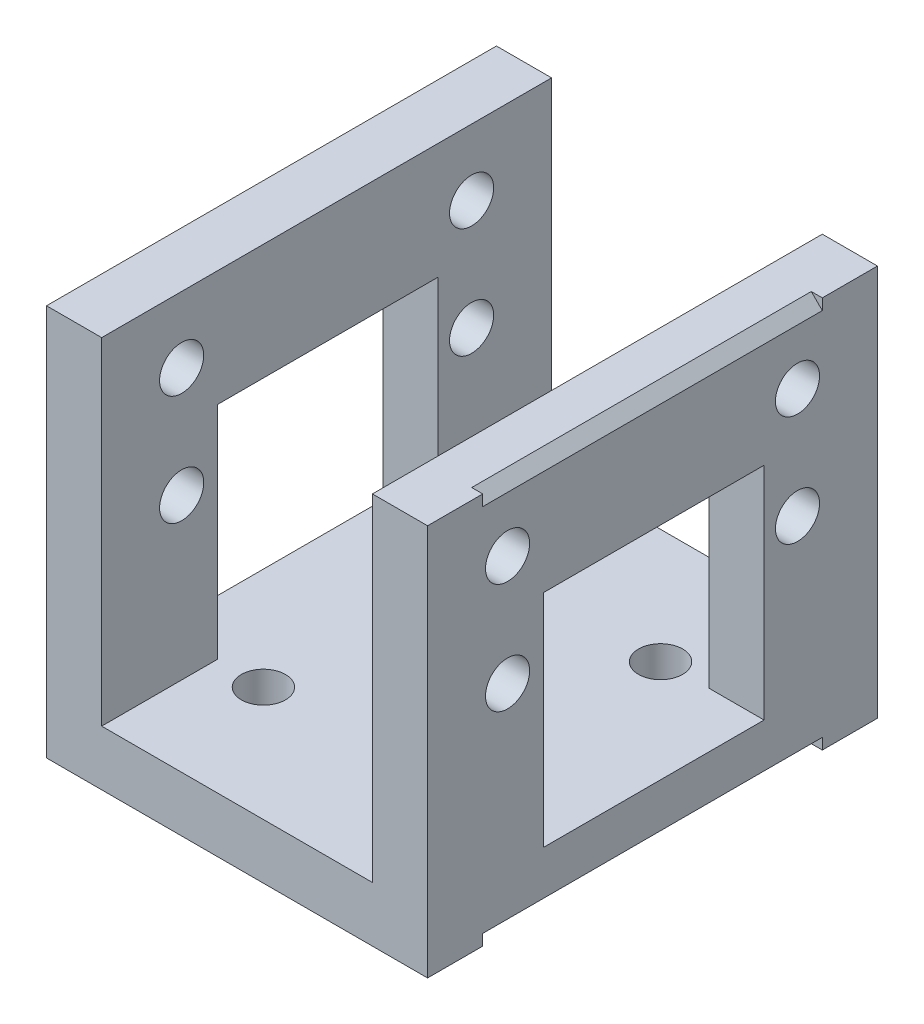
ISO-10303-21;
HEADER;
FILE_DESCRIPTION(('STEP AP214'),'2;1');
FILE_NAME('part.step','',(''),(''),'','','');
FILE_SCHEMA(('AUTOMOTIVE_DESIGN { 1 0 10303 214 1 1 1 1 }'));
ENDSEC;
DATA;
#1=APPLICATION_CONTEXT('core data for automotive mechanical design processes');
#2=APPLICATION_PROTOCOL_DEFINITION('international standard','automotive_design',2000,#1);
#3=PRODUCT_CONTEXT('',#1,'mechanical');
#4=PRODUCT('Part','Part','',(#3));
#5=PRODUCT_RELATED_PRODUCT_CATEGORY('part','',(#4));
#6=PRODUCT_DEFINITION_FORMATION('','',#4);
#7=PRODUCT_DEFINITION_CONTEXT('part definition',#1,'design');
#8=PRODUCT_DEFINITION('design','',#6,#7);
#9=PRODUCT_DEFINITION_SHAPE('','',#8);
#10=(LENGTH_UNIT() NAMED_UNIT(*) SI_UNIT(.MILLI.,.METRE.));
#11=(NAMED_UNIT(*) PLANE_ANGLE_UNIT() SI_UNIT($,.RADIAN.));
#12=(NAMED_UNIT(*) SI_UNIT($,.STERADIAN.) SOLID_ANGLE_UNIT());
#13=UNCERTAINTY_MEASURE_WITH_UNIT(LENGTH_MEASURE(1.E-05),#10,'distance_accuracy_value','');
#14=(GEOMETRIC_REPRESENTATION_CONTEXT(3) GLOBAL_UNCERTAINTY_ASSIGNED_CONTEXT((#13)) GLOBAL_UNIT_ASSIGNED_CONTEXT((#10,
#11,#12)) REPRESENTATION_CONTEXT('',''));
#15=CARTESIAN_POINT('',(0.,0.,0.));
#16=DIRECTION('',(0.,0.,1.));
#17=DIRECTION('',(1.,0.,0.));
#18=AXIS2_PLACEMENT_3D('',#15,#16,#17);
#19=CARTESIAN_POINT('',(1.00000000000001,0.,34.78));
#20=DIRECTION('',(0.707106781186545,0.70710678118655,0.));
#21=DIRECTION('',(0.,0.,-1.));
#22=AXIS2_PLACEMENT_3D('',#19,#20,#21);
#23=PLANE('',#22);
#24=DIRECTION('',(0.,0.,1.));
#25=VECTOR('',#24,1.);
#26=CARTESIAN_POINT('',(0.,1.,34.78));
#27=LINE('',#26,#25);
#28=CARTESIAN_POINT('',(0.,1.,2.));
#29=VERTEX_POINT('',#28);
#30=CARTESIAN_POINT('',(0.,1.,32.78));
#31=VERTEX_POINT('',#30);
#32=EDGE_CURVE('E54',#29,#31,#27,.T.);
#33=ORIENTED_EDGE('',*,*,#32,.F.);
#34=DIRECTION('',(-0.70710678118655,0.707106781186545,0.));
#35=VECTOR('',#34,1.);
#36=CARTESIAN_POINT('',(1.00000000000001,0.,2.));
#37=LINE('',#36,#35);
#38=CARTESIAN_POINT('',(1.00000000000001,0.,2.));
#39=VERTEX_POINT('',#38);
#40=EDGE_CURVE('E281',#29,#39,#37,.F.);
#41=ORIENTED_EDGE('',*,*,#40,.T.);
#42=DIRECTION('',(0.,0.,-1.));
#43=VECTOR('',#42,1.);
#44=CARTESIAN_POINT('',(1.00000000000001,0.,34.78));
#45=LINE('',#44,#43);
#46=CARTESIAN_POINT('',(1.00000000000001,0.,32.78));
#47=VERTEX_POINT('',#46);
#48=EDGE_CURVE('E472',#47,#39,#45,.T.);
#49=ORIENTED_EDGE('',*,*,#48,.F.);
#50=DIRECTION('',(0.70710678118655,-0.707106781186545,0.));
#51=VECTOR('',#50,1.);
#52=CARTESIAN_POINT('',(1.00000000000001,0.,32.78));
#53=LINE('',#52,#51);
#54=EDGE_CURVE('E332',#47,#31,#53,.F.);
#55=ORIENTED_EDGE('',*,*,#54,.T.);
#56=EDGE_LOOP('',(#33,#41,#49,#55));
#57=FACE_BOUND('',#56,.T.);
#58=ADVANCED_FACE('F50',(#57),#23,.F.);
#59=CARTESIAN_POINT('',(33.54,35.5,34.78));
#60=DIRECTION('',(-0.70710678118655,-0.707106781186545,0.));
#61=DIRECTION('',(0.,0.,-1.));
#62=AXIS2_PLACEMENT_3D('',#59,#60,#61);
#63=PLANE('',#62);
#64=DIRECTION('',(0.,0.,1.));
#65=VECTOR('',#64,1.);
#66=CARTESIAN_POINT('',(34.54,34.5,34.78));
#67=LINE('',#66,#65);
#68=CARTESIAN_POINT('',(34.54,34.5,2.));
#69=VERTEX_POINT('',#68);
#70=CARTESIAN_POINT('',(34.54,34.5,32.78));
#71=VERTEX_POINT('',#70);
#72=EDGE_CURVE('E467',#69,#71,#67,.T.);
#73=ORIENTED_EDGE('',*,*,#72,.F.);
#74=DIRECTION('',(0.707106781186545,-0.70710678118655,0.));
#75=VECTOR('',#74,1.);
#76=CARTESIAN_POINT('',(33.54,35.5,2.));
#77=LINE('',#76,#75);
#78=CARTESIAN_POINT('',(33.54,35.5,2.));
#79=VERTEX_POINT('',#78);
#80=EDGE_CURVE('E284',#69,#79,#77,.F.);
#81=ORIENTED_EDGE('',*,*,#80,.T.);
#82=DIRECTION('',(0.,0.,-1.));
#83=VECTOR('',#82,1.);
#84=CARTESIAN_POINT('',(33.54,35.5,34.78));
#85=LINE('',#84,#83);
#86=CARTESIAN_POINT('',(33.54,35.5,32.78));
#87=VERTEX_POINT('',#86);
#88=EDGE_CURVE('E473',#87,#79,#85,.T.);
#89=ORIENTED_EDGE('',*,*,#88,.F.);
#90=DIRECTION('',(-0.707106781186545,0.70710678118655,0.));
#91=VECTOR('',#90,1.);
#92=CARTESIAN_POINT('',(33.54,35.5,32.78));
#93=LINE('',#92,#91);
#94=EDGE_CURVE('E328',#87,#71,#93,.F.);
#95=ORIENTED_EDGE('',*,*,#94,.T.);
#96=EDGE_LOOP('',(#73,#81,#89,#95));
#97=FACE_BOUND('',#96,.T.);
#98=ADVANCED_FACE('F539',(#97),#63,.F.);
#99=CARTESIAN_POINT('',(34.54,1.,34.78));
#100=DIRECTION('',(-0.707106781186545,0.70710678118655,0.));
#101=DIRECTION('',(0.,0.,-1.));
#102=AXIS2_PLACEMENT_3D('',#99,#100,#101);
#103=PLANE('',#102);
#104=DIRECTION('',(0.,0.,1.));
#105=VECTOR('',#104,1.);
#106=CARTESIAN_POINT('',(33.54,0.,34.78));
#107=LINE('',#106,#105);
#108=CARTESIAN_POINT('',(33.54,0.,2.));
#109=VERTEX_POINT('',#108);
#110=CARTESIAN_POINT('',(33.54,0.,32.78));
#111=VERTEX_POINT('',#110);
#112=EDGE_CURVE('E65',#109,#111,#107,.T.);
#113=ORIENTED_EDGE('',*,*,#112,.F.);
#114=DIRECTION('',(-0.70710678118655,-0.707106781186545,0.));
#115=VECTOR('',#114,1.);
#116=CARTESIAN_POINT('',(34.54,1.,2.));
#117=LINE('',#116,#115);
#118=CARTESIAN_POINT('',(34.54,1.,2.));
#119=VERTEX_POINT('',#118);
#120=EDGE_CURVE('E277',#109,#119,#117,.F.);
#121=ORIENTED_EDGE('',*,*,#120,.T.);
#122=DIRECTION('',(0.,0.,-1.));
#123=VECTOR('',#122,1.);
#124=CARTESIAN_POINT('',(34.54,1.,34.78));
#125=LINE('',#124,#123);
#126=CARTESIAN_POINT('',(34.54,1.00000000000001,32.78));
#127=VERTEX_POINT('',#126);
#128=EDGE_CURVE('E466',#127,#119,#125,.T.);
#129=ORIENTED_EDGE('',*,*,#128,.F.);
#130=DIRECTION('',(0.70710678118655,0.707106781186545,0.));
#131=VECTOR('',#130,1.);
#132=CARTESIAN_POINT('',(34.54,1.,32.78));
#133=LINE('',#132,#131);
#134=EDGE_CURVE('E11',#127,#111,#133,.F.);
#135=ORIENTED_EDGE('',*,*,#134,.T.);
#136=EDGE_LOOP('',(#113,#121,#129,#135));
#137=FACE_BOUND('',#136,.T.);
#138=ADVANCED_FACE('F547',(#137),#103,.F.);
#139=CARTESIAN_POINT('',(34.54,0.,34.78));
#140=DIRECTION('',(-1.,0.,0.));
#141=DIRECTION('',(0.,0.,1.));
#142=AXIS2_PLACEMENT_3D('',#139,#140,#141);
#143=PLANE('',#142);
#144=DIRECTION('',(0.,-1.,0.));
#145=VECTOR('',#144,1.);
#146=CARTESIAN_POINT('',(34.54,0.,2.));
#147=LINE('',#146,#145);
#148=CARTESIAN_POINT('',(34.54,35.5,2.));
#149=VERTEX_POINT('',#148);
#150=EDGE_CURVE('E265',#149,#69,#147,.T.);
#151=ORIENTED_EDGE('',*,*,#150,.T.);
#152=ORIENTED_EDGE('',*,*,#72,.T.);
#153=DIRECTION('',(0.,-1.,0.));
#154=VECTOR('',#153,1.);
#155=CARTESIAN_POINT('',(34.54,0.,32.78));
#156=LINE('',#155,#154);
#157=CARTESIAN_POINT('',(34.54,35.5,32.78));
#158=VERTEX_POINT('',#157);
#159=EDGE_CURVE('E320',#158,#71,#156,.T.);
#160=ORIENTED_EDGE('',*,*,#159,.F.);
#161=DIRECTION('',(0.,0.,1.));
#162=VECTOR('',#161,1.);
#163=CARTESIAN_POINT('',(34.54,35.5,32.78));
#164=LINE('',#163,#162);
#165=CARTESIAN_POINT('',(34.54,35.5,37.78));
#166=VERTEX_POINT('',#165);
#167=EDGE_CURVE('E321',#158,#166,#164,.T.);
#168=ORIENTED_EDGE('',*,*,#167,.T.);
#169=DIRECTION('',(0.,-1.,0.));
#170=VECTOR('',#169,1.);
#171=CARTESIAN_POINT('',(34.54,0.,37.78));
#172=LINE('',#171,#170);
#173=CARTESIAN_POINT('',(34.54,0.,37.78));
#174=VERTEX_POINT('',#173);
#175=EDGE_CURVE('E294',#166,#174,#172,.T.);
#176=ORIENTED_EDGE('',*,*,#175,.T.);
#177=DIRECTION('',(0.,0.,1.));
#178=VECTOR('',#177,1.);
#179=CARTESIAN_POINT('',(34.54,0.,32.78));
#180=LINE('',#179,#178);
#181=CARTESIAN_POINT('',(34.54,0.,32.78));
#182=VERTEX_POINT('',#181);
#183=EDGE_CURVE('E329',#182,#174,#180,.T.);
#184=ORIENTED_EDGE('',*,*,#183,.F.);
#185=EDGE_CURVE('E317',#127,#182,#156,.T.);
#186=ORIENTED_EDGE('',*,*,#185,.F.);
#187=ORIENTED_EDGE('',*,*,#128,.T.);
#188=CARTESIAN_POINT('',(34.54,0.,2.));
#189=VERTEX_POINT('',#188);
#190=EDGE_CURVE('E262',#119,#189,#147,.T.);
#191=ORIENTED_EDGE('',*,*,#190,.T.);
#192=DIRECTION('',(0.,0.,-1.));
#193=VECTOR('',#192,1.);
#194=CARTESIAN_POINT('',(34.54,0.,2.));
#195=LINE('',#194,#193);
#196=CARTESIAN_POINT('',(34.54,0.,-3.));
#197=VERTEX_POINT('',#196);
#198=EDGE_CURVE('E280',#189,#197,#195,.T.);
#199=ORIENTED_EDGE('',*,*,#198,.T.);
#200=DIRECTION('',(0.,-1.,0.));
#201=VECTOR('',#200,1.);
#202=CARTESIAN_POINT('',(34.54,0.,-3.));
#203=LINE('',#202,#201);
#204=CARTESIAN_POINT('',(34.54,35.5,-3.));
#205=VERTEX_POINT('',#204);
#206=EDGE_CURVE('E251',#205,#197,#203,.T.);
#207=ORIENTED_EDGE('',*,*,#206,.F.);
#208=DIRECTION('',(0.,0.,-1.));
#209=VECTOR('',#208,1.);
#210=CARTESIAN_POINT('',(34.54,35.5,2.));
#211=LINE('',#210,#209);
#212=EDGE_CURVE('E271',#149,#205,#211,.T.);
#213=ORIENTED_EDGE('',*,*,#212,.F.);
#214=EDGE_LOOP('',(#151,#152,#160,#168,#176,#184,#186,#187,#191,#199,#207,#213));
#215=FACE_BOUND('',#214,.T.);
#216=CARTESIAN_POINT('',(34.54,29.5,30.53));
#217=DIRECTION('',(1.,0.,0.));
#218=DIRECTION('',(0.,0.,-1.));
#219=AXIS2_PLACEMENT_3D('',#216,#217,#218);
#220=CIRCLE('',#219,2.);
#221=CARTESIAN_POINT('',(34.54,29.5,28.53));
#222=VERTEX_POINT('',#221);
#223=EDGE_CURVE('E360',#222,#222,#220,.T.);
#224=ORIENTED_EDGE('',*,*,#223,.F.);
#225=EDGE_LOOP('',(#224));
#226=FACE_BOUND('',#225,.T.);
#227=CARTESIAN_POINT('',(34.54,29.5,4.24999999999999));
#228=DIRECTION('',(1.,0.,0.));
#229=DIRECTION('',(0.,0.,-1.));
#230=AXIS2_PLACEMENT_3D('',#227,#228,#229);
#231=CIRCLE('',#230,2.);
#232=CARTESIAN_POINT('',(34.54,29.5,2.24999999999999));
#233=VERTEX_POINT('',#232);
#234=EDGE_CURVE('E368',#233,#233,#231,.F.);
#235=ORIENTED_EDGE('',*,*,#234,.T.);
#236=EDGE_LOOP('',(#235));
#237=FACE_BOUND('',#236,.T.);
#238=DIRECTION('',(0.,0.,-1.));
#239=VECTOR('',#238,1.);
#240=CARTESIAN_POINT('',(34.54,5.,27.28));
#241=LINE('',#240,#239);
#242=CARTESIAN_POINT('',(34.54,5.,27.28));
#243=VERTEX_POINT('',#242);
#244=CARTESIAN_POINT('',(34.54,5.,7.28));
#245=VERTEX_POINT('',#244);
#246=EDGE_CURVE('E417',#243,#245,#241,.T.);
#247=ORIENTED_EDGE('',*,*,#246,.F.);
#248=DIRECTION('',(0.,-1.,0.));
#249=VECTOR('',#248,1.);
#250=CARTESIAN_POINT('',(34.54,5.,27.28));
#251=LINE('',#250,#249);
#252=CARTESIAN_POINT('',(34.54,25.,27.28));
#253=VERTEX_POINT('',#252);
#254=EDGE_CURVE('E66',#253,#243,#251,.T.);
#255=ORIENTED_EDGE('',*,*,#254,.F.);
#256=DIRECTION('',(0.,0.,1.));
#257=VECTOR('',#256,1.);
#258=CARTESIAN_POINT('',(34.54,25.,27.28));
#259=LINE('',#258,#257);
#260=CARTESIAN_POINT('',(34.54,25.,7.28));
#261=VERTEX_POINT('',#260);
#262=EDGE_CURVE('E421',#261,#253,#259,.T.);
#263=ORIENTED_EDGE('',*,*,#262,.F.);
#264=DIRECTION('',(0.,1.,0.));
#265=VECTOR('',#264,1.);
#266=CARTESIAN_POINT('',(34.54,5.,7.28));
#267=LINE('',#266,#265);
#268=EDGE_CURVE('E420',#245,#261,#267,.T.);
#269=ORIENTED_EDGE('',*,*,#268,.F.);
#270=EDGE_LOOP('',(#247,#255,#263,#269));
#271=FACE_BOUND('',#270,.T.);
#272=CARTESIAN_POINT('',(34.54,19.5,30.53));
#273=DIRECTION('',(1.,0.,0.));
#274=DIRECTION('',(0.,0.,-1.));
#275=AXIS2_PLACEMENT_3D('',#272,#273,#274);
#276=CIRCLE('',#275,2.);
#277=CARTESIAN_POINT('',(34.54,19.5,28.53));
#278=VERTEX_POINT('',#277);
#279=EDGE_CURVE('E370',#278,#278,#276,.F.);
#280=ORIENTED_EDGE('',*,*,#279,.T.);
#281=EDGE_LOOP('',(#280));
#282=FACE_BOUND('',#281,.T.);
#283=CARTESIAN_POINT('',(34.54,19.5,4.24999999999999));
#284=DIRECTION('',(1.,0.,0.));
#285=DIRECTION('',(0.,0.,-1.));
#286=AXIS2_PLACEMENT_3D('',#283,#284,#285);
#287=CIRCLE('',#286,2.);
#288=CARTESIAN_POINT('',(34.54,19.5,2.24999999999999));
#289=VERTEX_POINT('',#288);
#290=EDGE_CURVE('E359',#289,#289,#287,.T.);
#291=ORIENTED_EDGE('',*,*,#290,.F.);
#292=EDGE_LOOP('',(#291));
#293=FACE_BOUND('',#292,.T.);
#294=ADVANCED_FACE('F529',(#215,#226,#237,#271,#282,#293),#143,.F.);
#295=CARTESIAN_POINT('',(29.54,5.,34.78));
#296=DIRECTION('',(1.,0.,0.));
#297=DIRECTION('',(0.,0.,-1.));
#298=AXIS2_PLACEMENT_3D('',#295,#296,#297);
#299=PLANE('',#298);
#300=DIRECTION('',(0.,-1.,0.));
#301=VECTOR('',#300,1.);
#302=CARTESIAN_POINT('',(29.54,0.,-3.));
#303=LINE('',#302,#301);
#304=CARTESIAN_POINT('',(29.54,35.5,-3.));
#305=VERTEX_POINT('',#304);
#306=CARTESIAN_POINT('',(29.54,5.,-3.));
#307=VERTEX_POINT('',#306);
#308=EDGE_CURVE('E246',#305,#307,#303,.T.);
#309=ORIENTED_EDGE('',*,*,#308,.T.);
#310=DIRECTION('',(0.,0.,-1.));
#311=VECTOR('',#310,1.);
#312=CARTESIAN_POINT('',(29.54,5.,34.78));
#313=LINE('',#312,#311);
#314=CARTESIAN_POINT('',(29.54,5.,7.28));
#315=VERTEX_POINT('',#314);
#316=EDGE_CURVE('E461',#315,#307,#313,.T.);
#317=ORIENTED_EDGE('',*,*,#316,.F.);
#318=DIRECTION('',(0.,1.,0.));
#319=VECTOR('',#318,1.);
#320=CARTESIAN_POINT('',(29.54,5.,7.28));
#321=LINE('',#320,#319);
#322=CARTESIAN_POINT('',(29.54,25.,7.28));
#323=VERTEX_POINT('',#322);
#324=EDGE_CURVE('E442',#315,#323,#321,.T.);
#325=ORIENTED_EDGE('',*,*,#324,.T.);
#326=DIRECTION('',(0.,0.,1.));
#327=VECTOR('',#326,1.);
#328=CARTESIAN_POINT('',(29.54,25.,34.78));
#329=LINE('',#328,#327);
#330=CARTESIAN_POINT('',(29.54,25.,27.28));
#331=VERTEX_POINT('',#330);
#332=EDGE_CURVE('E446',#323,#331,#329,.T.);
#333=ORIENTED_EDGE('',*,*,#332,.T.);
#334=DIRECTION('',(0.,-1.,0.));
#335=VECTOR('',#334,1.);
#336=CARTESIAN_POINT('',(29.54,5.,27.28));
#337=LINE('',#336,#335);
#338=CARTESIAN_POINT('',(29.54,5.,27.28));
#339=VERTEX_POINT('',#338);
#340=EDGE_CURVE('E453',#331,#339,#337,.T.);
#341=ORIENTED_EDGE('',*,*,#340,.T.);
#342=CARTESIAN_POINT('',(29.54,5.,37.78));
#343=VERTEX_POINT('',#342);
#344=EDGE_CURVE('E462',#343,#339,#313,.T.);
#345=ORIENTED_EDGE('',*,*,#344,.F.);
#346=DIRECTION('',(0.,-1.,0.));
#347=VECTOR('',#346,1.);
#348=CARTESIAN_POINT('',(29.54,0.,37.78));
#349=LINE('',#348,#347);
#350=CARTESIAN_POINT('',(29.54,35.5,37.78));
#351=VERTEX_POINT('',#350);
#352=EDGE_CURVE('E301',#351,#343,#349,.T.);
#353=ORIENTED_EDGE('',*,*,#352,.F.);
#354=DIRECTION('',(0.,0.,-1.));
#355=VECTOR('',#354,1.);
#356=CARTESIAN_POINT('',(29.54,35.5,34.78));
#357=LINE('',#356,#355);
#358=EDGE_CURVE('E463',#351,#305,#357,.T.);
#359=ORIENTED_EDGE('',*,*,#358,.T.);
#360=EDGE_LOOP('',(#309,#317,#325,#333,#341,#345,#353,#359));
#361=FACE_BOUND('',#360,.T.);
#362=CARTESIAN_POINT('',(29.54,19.5,4.24999999999999));
#363=DIRECTION('',(1.,0.,0.));
#364=DIRECTION('',(0.,0.,-1.));
#365=AXIS2_PLACEMENT_3D('',#362,#363,#364);
#366=CIRCLE('',#365,2.);
#367=CARTESIAN_POINT('',(29.54,19.5,2.24999999999999));
#368=VERTEX_POINT('',#367);
#369=EDGE_CURVE('E394',#368,#368,#366,.T.);
#370=ORIENTED_EDGE('',*,*,#369,.T.);
#371=EDGE_LOOP('',(#370));
#372=FACE_BOUND('',#371,.T.);
#373=CARTESIAN_POINT('',(29.54,19.5,30.53));
#374=DIRECTION('',(1.,0.,0.));
#375=DIRECTION('',(0.,0.,-1.));
#376=AXIS2_PLACEMENT_3D('',#373,#374,#375);
#377=CIRCLE('',#376,2.);
#378=CARTESIAN_POINT('',(29.54,19.5,28.53));
#379=VERTEX_POINT('',#378);
#380=EDGE_CURVE('E387',#379,#379,#377,.F.);
#381=ORIENTED_EDGE('',*,*,#380,.F.);
#382=EDGE_LOOP('',(#381));
#383=FACE_BOUND('',#382,.T.);
#384=CARTESIAN_POINT('',(29.54,29.5,4.24999999999999));
#385=DIRECTION('',(1.,0.,0.));
#386=DIRECTION('',(0.,0.,-1.));
#387=AXIS2_PLACEMENT_3D('',#384,#385,#386);
#388=CIRCLE('',#387,2.);
#389=CARTESIAN_POINT('',(29.54,29.5,2.24999999999999));
#390=VERTEX_POINT('',#389);
#391=EDGE_CURVE('E399',#390,#390,#388,.F.);
#392=ORIENTED_EDGE('',*,*,#391,.F.);
#393=EDGE_LOOP('',(#392));
#394=FACE_BOUND('',#393,.T.);
#395=CARTESIAN_POINT('',(29.54,29.5,30.53));
#396=DIRECTION('',(1.,0.,0.));
#397=DIRECTION('',(0.,0.,-1.));
#398=AXIS2_PLACEMENT_3D('',#395,#396,#397);
#399=CIRCLE('',#398,2.);
#400=CARTESIAN_POINT('',(29.54,29.5,28.53));
#401=VERTEX_POINT('',#400);
#402=EDGE_CURVE('E404',#401,#401,#399,.T.);
#403=ORIENTED_EDGE('',*,*,#402,.T.);
#404=EDGE_LOOP('',(#403));
#405=FACE_BOUND('',#404,.T.);
#406=ADVANCED_FACE('F518',(#361,#372,#383,#394,#405),#299,.F.);
#407=CARTESIAN_POINT('',(5.,5.,34.78));
#408=DIRECTION('',(-1.,0.,0.));
#409=DIRECTION('',(0.,0.,1.));
#410=AXIS2_PLACEMENT_3D('',#407,#408,#409);
#411=PLANE('',#410);
#412=DIRECTION('',(0.,1.,0.));
#413=VECTOR('',#412,1.);
#414=CARTESIAN_POINT('',(5.,0.,-3.));
#415=LINE('',#414,#413);
#416=CARTESIAN_POINT('',(5.,5.,-3.));
#417=VERTEX_POINT('',#416);
#418=CARTESIAN_POINT('',(5.,35.5,-3.));
#419=VERTEX_POINT('',#418);
#420=EDGE_CURVE('E234',#417,#419,#415,.T.);
#421=ORIENTED_EDGE('',*,*,#420,.T.);
#422=DIRECTION('',(0.,0.,-1.));
#423=VECTOR('',#422,1.);
#424=CARTESIAN_POINT('',(5.,35.5,34.78));
#425=LINE('',#424,#423);
#426=CARTESIAN_POINT('',(5.,35.5,37.78));
#427=VERTEX_POINT('',#426);
#428=EDGE_CURVE('E218',#427,#419,#425,.T.);
#429=ORIENTED_EDGE('',*,*,#428,.F.);
#430=DIRECTION('',(0.,1.,0.));
#431=VECTOR('',#430,1.);
#432=CARTESIAN_POINT('',(5.,0.,37.78));
#433=LINE('',#432,#431);
#434=CARTESIAN_POINT('',(5.,5.,37.78));
#435=VERTEX_POINT('',#434);
#436=EDGE_CURVE('E310',#435,#427,#433,.T.);
#437=ORIENTED_EDGE('',*,*,#436,.F.);
#438=DIRECTION('',(0.,0.,-1.));
#439=VECTOR('',#438,1.);
#440=CARTESIAN_POINT('',(5.,5.,34.78));
#441=LINE('',#440,#439);
#442=CARTESIAN_POINT('',(5.,5.,27.28));
#443=VERTEX_POINT('',#442);
#444=EDGE_CURVE('E460',#435,#443,#441,.T.);
#445=ORIENTED_EDGE('',*,*,#444,.T.);
#446=DIRECTION('',(0.,1.,0.));
#447=VECTOR('',#446,1.);
#448=CARTESIAN_POINT('',(5.,5.,27.28));
#449=LINE('',#448,#447);
#450=CARTESIAN_POINT('',(5.,25.,27.28));
#451=VERTEX_POINT('',#450);
#452=EDGE_CURVE('E455',#443,#451,#449,.T.);
#453=ORIENTED_EDGE('',*,*,#452,.T.);
#454=DIRECTION('',(0.,0.,-1.));
#455=VECTOR('',#454,1.);
#456=CARTESIAN_POINT('',(5.,25.,34.78));
#457=LINE('',#456,#455);
#458=CARTESIAN_POINT('',(5.,25.,7.28));
#459=VERTEX_POINT('',#458);
#460=EDGE_CURVE('E447',#451,#459,#457,.T.);
#461=ORIENTED_EDGE('',*,*,#460,.T.);
#462=DIRECTION('',(0.,-1.,0.));
#463=VECTOR('',#462,1.);
#464=CARTESIAN_POINT('',(5.,5.,7.28));
#465=LINE('',#464,#463);
#466=CARTESIAN_POINT('',(5.,5.,7.28));
#467=VERTEX_POINT('',#466);
#468=EDGE_CURVE('E441',#459,#467,#465,.T.);
#469=ORIENTED_EDGE('',*,*,#468,.T.);
#470=EDGE_CURVE('E228',#467,#417,#441,.T.);
#471=ORIENTED_EDGE('',*,*,#470,.T.);
#472=EDGE_LOOP('',(#421,#429,#437,#445,#453,#461,#469,#471));
#473=FACE_BOUND('',#472,.T.);
#474=CARTESIAN_POINT('',(5.,19.5,4.24999999999999));
#475=DIRECTION('',(-1.,0.,0.));
#476=DIRECTION('',(0.,0.,1.));
#477=AXIS2_PLACEMENT_3D('',#474,#475,#476);
#478=CIRCLE('',#477,2.);
#479=CARTESIAN_POINT('',(5.,19.5,6.24999999999999));
#480=VERTEX_POINT('',#479);
#481=EDGE_CURVE('E386',#480,#480,#478,.T.);
#482=ORIENTED_EDGE('',*,*,#481,.T.);
#483=EDGE_LOOP('',(#482));
#484=FACE_BOUND('',#483,.T.);
#485=CARTESIAN_POINT('',(5.,19.5,30.53));
#486=DIRECTION('',(-1.,0.,0.));
#487=DIRECTION('',(0.,0.,1.));
#488=AXIS2_PLACEMENT_3D('',#485,#486,#487);
#489=CIRCLE('',#488,2.);
#490=CARTESIAN_POINT('',(5.,19.5,32.53));
#491=VERTEX_POINT('',#490);
#492=EDGE_CURVE('E384',#491,#491,#489,.F.);
#493=ORIENTED_EDGE('',*,*,#492,.F.);
#494=EDGE_LOOP('',(#493));
#495=FACE_BOUND('',#494,.T.);
#496=CARTESIAN_POINT('',(5.,29.5,4.24999999999999));
#497=DIRECTION('',(-1.,0.,0.));
#498=DIRECTION('',(0.,0.,1.));
#499=AXIS2_PLACEMENT_3D('',#496,#497,#498);
#500=CIRCLE('',#499,2.);
#501=CARTESIAN_POINT('',(5.,29.5,6.24999999999999));
#502=VERTEX_POINT('',#501);
#503=EDGE_CURVE('E391',#502,#502,#500,.F.);
#504=ORIENTED_EDGE('',*,*,#503,.F.);
#505=EDGE_LOOP('',(#504));
#506=FACE_BOUND('',#505,.T.);
#507=CARTESIAN_POINT('',(5.,29.5,30.53));
#508=DIRECTION('',(-1.,0.,0.));
#509=DIRECTION('',(0.,0.,1.));
#510=AXIS2_PLACEMENT_3D('',#507,#508,#509);
#511=CIRCLE('',#510,2.);
#512=CARTESIAN_POINT('',(5.,29.5,32.53));
#513=VERTEX_POINT('',#512);
#514=EDGE_CURVE('E402',#513,#513,#511,.T.);
#515=ORIENTED_EDGE('',*,*,#514,.T.);
#516=EDGE_LOOP('',(#515));
#517=FACE_BOUND('',#516,.T.);
#518=ADVANCED_FACE('F239',(#473,#484,#495,#506,#517),#411,.F.);
#519=CARTESIAN_POINT('',(0.,0.,34.78));
#520=DIRECTION('',(1.,0.,0.));
#521=DIRECTION('',(0.,0.,-1.));
#522=AXIS2_PLACEMENT_3D('',#519,#520,#521);
#523=PLANE('',#522);
#524=DIRECTION('',(0.,1.,0.));
#525=VECTOR('',#524,1.);
#526=CARTESIAN_POINT('',(0.,0.,2.));
#527=LINE('',#526,#525);
#528=CARTESIAN_POINT('',(0.,0.,2.));
#529=VERTEX_POINT('',#528);
#530=EDGE_CURVE('E270',#529,#29,#527,.T.);
#531=ORIENTED_EDGE('',*,*,#530,.T.);
#532=ORIENTED_EDGE('',*,*,#32,.T.);
#533=DIRECTION('',(0.,1.,0.));
#534=VECTOR('',#533,1.);
#535=CARTESIAN_POINT('',(0.,0.,32.78));
#536=LINE('',#535,#534);
#537=CARTESIAN_POINT('',(0.,0.,32.78));
#538=VERTEX_POINT('',#537);
#539=EDGE_CURVE('E307',#538,#31,#536,.T.);
#540=ORIENTED_EDGE('',*,*,#539,.F.);
#541=DIRECTION('',(0.,0.,1.));
#542=VECTOR('',#541,1.);
#543=CARTESIAN_POINT('',(0.,0.,32.78));
#544=LINE('',#543,#542);
#545=CARTESIAN_POINT('',(0.,0.,37.78));
#546=VERTEX_POINT('',#545);
#547=EDGE_CURVE('E324',#538,#546,#544,.T.);
#548=ORIENTED_EDGE('',*,*,#547,.T.);
#549=DIRECTION('',(0.,1.,0.));
#550=VECTOR('',#549,1.);
#551=CARTESIAN_POINT('',(0.,0.,37.78));
#552=LINE('',#551,#550);
#553=CARTESIAN_POINT('',(0.,35.5,37.78));
#554=VERTEX_POINT('',#553);
#555=EDGE_CURVE('E288',#546,#554,#552,.T.);
#556=ORIENTED_EDGE('',*,*,#555,.T.);
#557=DIRECTION('',(0.,0.,-1.));
#558=VECTOR('',#557,1.);
#559=CARTESIAN_POINT('',(0.,35.5,34.78));
#560=LINE('',#559,#558);
#561=CARTESIAN_POINT('',(0.,35.5,-3.));
#562=VERTEX_POINT('',#561);
#563=EDGE_CURVE('E227',#554,#562,#560,.T.);
#564=ORIENTED_EDGE('',*,*,#563,.T.);
#565=DIRECTION('',(0.,1.,0.));
#566=VECTOR('',#565,1.);
#567=CARTESIAN_POINT('',(0.,0.,-3.));
#568=LINE('',#567,#566);
#569=CARTESIAN_POINT('',(0.,0.,-3.));
#570=VERTEX_POINT('',#569);
#571=EDGE_CURVE('E238',#570,#562,#568,.T.);
#572=ORIENTED_EDGE('',*,*,#571,.F.);
#573=DIRECTION('',(0.,0.,-1.));
#574=VECTOR('',#573,1.);
#575=CARTESIAN_POINT('',(0.,0.,2.));
#576=LINE('',#575,#574);
#577=EDGE_CURVE('E274',#529,#570,#576,.T.);
#578=ORIENTED_EDGE('',*,*,#577,.F.);
#579=EDGE_LOOP('',(#531,#532,#540,#548,#556,#564,#572,#578));
#580=FACE_BOUND('',#579,.T.);
#581=CARTESIAN_POINT('',(0.,29.5,30.53));
#582=DIRECTION('',(1.,0.,0.));
#583=DIRECTION('',(0.,0.,-1.));
#584=AXIS2_PLACEMENT_3D('',#581,#582,#583);
#585=CIRCLE('',#584,2.);
#586=CARTESIAN_POINT('',(0.,29.5,28.53));
#587=VERTEX_POINT('',#586);
#588=EDGE_CURVE('E371',#587,#587,#585,.F.);
#589=ORIENTED_EDGE('',*,*,#588,.F.);
#590=EDGE_LOOP('',(#589));
#591=FACE_BOUND('',#590,.T.);
#592=CARTESIAN_POINT('',(0.,29.5,4.24999999999999));
#593=DIRECTION('',(1.,0.,0.));
#594=DIRECTION('',(0.,0.,-1.));
#595=AXIS2_PLACEMENT_3D('',#592,#593,#594);
#596=CIRCLE('',#595,2.);
#597=CARTESIAN_POINT('',(0.,29.5,2.24999999999999));
#598=VERTEX_POINT('',#597);
#599=EDGE_CURVE('E364',#598,#598,#596,.T.);
#600=ORIENTED_EDGE('',*,*,#599,.T.);
#601=EDGE_LOOP('',(#600));
#602=FACE_BOUND('',#601,.T.);
#603=DIRECTION('',(0.,0.,-1.));
#604=VECTOR('',#603,1.);
#605=CARTESIAN_POINT('',(0.,25.,27.28));
#606=LINE('',#605,#604);
#607=CARTESIAN_POINT('',(0.,25.,27.28));
#608=VERTEX_POINT('',#607);
#609=CARTESIAN_POINT('',(0.,25.,7.28));
#610=VERTEX_POINT('',#609);
#611=EDGE_CURVE('E408',#608,#610,#606,.T.);
#612=ORIENTED_EDGE('',*,*,#611,.F.);
#613=DIRECTION('',(0.,1.,0.));
#614=VECTOR('',#613,1.);
#615=CARTESIAN_POINT('',(0.,5.,27.28));
#616=LINE('',#615,#614);
#617=CARTESIAN_POINT('',(0.,5.,27.28));
#618=VERTEX_POINT('',#617);
#619=EDGE_CURVE('E412',#618,#608,#616,.T.);
#620=ORIENTED_EDGE('',*,*,#619,.F.);
#621=DIRECTION('',(0.,0.,1.));
#622=VECTOR('',#621,1.);
#623=CARTESIAN_POINT('',(0.,5.,27.28));
#624=LINE('',#623,#622);
#625=CARTESIAN_POINT('',(0.,5.,7.28));
#626=VERTEX_POINT('',#625);
#627=EDGE_CURVE('E411',#626,#618,#624,.T.);
#628=ORIENTED_EDGE('',*,*,#627,.F.);
#629=DIRECTION('',(0.,-1.,0.));
#630=VECTOR('',#629,1.);
#631=CARTESIAN_POINT('',(0.,5.,7.28));
#632=LINE('',#631,#630);
#633=EDGE_CURVE('E410',#610,#626,#632,.T.);
#634=ORIENTED_EDGE('',*,*,#633,.F.);
#635=EDGE_LOOP('',(#612,#620,#628,#634));
#636=FACE_BOUND('',#635,.T.);
#637=CARTESIAN_POINT('',(0.,19.5,30.53));
#638=DIRECTION('',(1.,0.,0.));
#639=DIRECTION('',(0.,0.,-1.));
#640=AXIS2_PLACEMENT_3D('',#637,#638,#639);
#641=CIRCLE('',#640,2.);
#642=CARTESIAN_POINT('',(0.,19.5,28.53));
#643=VERTEX_POINT('',#642);
#644=EDGE_CURVE('E379',#643,#643,#641,.T.);
#645=ORIENTED_EDGE('',*,*,#644,.T.);
#646=EDGE_LOOP('',(#645));
#647=FACE_BOUND('',#646,.T.);
#648=CARTESIAN_POINT('',(0.,19.5,4.24999999999999));
#649=DIRECTION('',(1.,0.,0.));
#650=DIRECTION('',(0.,0.,-1.));
#651=AXIS2_PLACEMENT_3D('',#648,#649,#650);
#652=CIRCLE('',#651,2.);
#653=CARTESIAN_POINT('',(0.,19.5,2.24999999999999));
#654=VERTEX_POINT('',#653);
#655=EDGE_CURVE('E361',#654,#654,#652,.F.);
#656=ORIENTED_EDGE('',*,*,#655,.F.);
#657=EDGE_LOOP('',(#656));
#658=FACE_BOUND('',#657,.T.);
#659=ADVANCED_FACE('F476',(#580,#591,#602,#636,#647,#658),#523,.F.);
#660=CARTESIAN_POINT('',(0.,0.,34.78));
#661=DIRECTION('',(0.,1.,0.));
#662=DIRECTION('',(0.,0.,1.));
#663=AXIS2_PLACEMENT_3D('',#660,#661,#662);
#664=PLANE('',#663);
#665=DIRECTION('',(1.,0.,0.));
#666=VECTOR('',#665,1.);
#667=CARTESIAN_POINT('',(0.,0.,2.));
#668=LINE('',#667,#666);
#669=EDGE_CURVE('E267',#109,#189,#668,.T.);
#670=ORIENTED_EDGE('',*,*,#669,.F.);
#671=ORIENTED_EDGE('',*,*,#112,.T.);
#672=DIRECTION('',(1.,0.,0.));
#673=VECTOR('',#672,1.);
#674=CARTESIAN_POINT('',(0.,0.,32.78));
#675=LINE('',#674,#673);
#676=EDGE_CURVE('E315',#111,#182,#675,.T.);
#677=ORIENTED_EDGE('',*,*,#676,.T.);
#678=ORIENTED_EDGE('',*,*,#183,.T.);
#679=DIRECTION('',(1.,0.,0.));
#680=VECTOR('',#679,1.);
#681=CARTESIAN_POINT('',(0.,0.,37.78));
#682=LINE('',#681,#680);
#683=EDGE_CURVE('E292',#546,#174,#682,.T.);
#684=ORIENTED_EDGE('',*,*,#683,.F.);
#685=ORIENTED_EDGE('',*,*,#547,.F.);
#686=EDGE_CURVE('E312',#538,#47,#675,.T.);
#687=ORIENTED_EDGE('',*,*,#686,.T.);
#688=ORIENTED_EDGE('',*,*,#48,.T.);
#689=EDGE_CURVE('E269',#529,#39,#668,.T.);
#690=ORIENTED_EDGE('',*,*,#689,.F.);
#691=ORIENTED_EDGE('',*,*,#577,.T.);
#692=DIRECTION('',(1.,0.,0.));
#693=VECTOR('',#692,1.);
#694=CARTESIAN_POINT('',(0.,0.,-3.));
#695=LINE('',#694,#693);
#696=EDGE_CURVE('E260',#570,#197,#695,.T.);
#697=ORIENTED_EDGE('',*,*,#696,.T.);
#698=ORIENTED_EDGE('',*,*,#198,.F.);
#699=EDGE_LOOP('',(#670,#671,#677,#678,#684,#685,#687,#688,#690,#691,#697,#698));
#700=FACE_BOUND('',#699,.T.);
#701=CARTESIAN_POINT('',(9.27,0.,27.39));
#702=DIRECTION('',(0.,-1.,0.));
#703=DIRECTION('',(0.,0.,-1.));
#704=AXIS2_PLACEMENT_3D('',#701,#702,#703);
#705=CIRCLE('',#704,2.);
#706=CARTESIAN_POINT('',(9.27,0.,25.39));
#707=VERTEX_POINT('',#706);
#708=EDGE_CURVE('E344',#707,#707,#705,.T.);
#709=ORIENTED_EDGE('',*,*,#708,.F.);
#710=EDGE_LOOP('',(#709));
#711=FACE_BOUND('',#710,.T.);
#712=CARTESIAN_POINT('',(25.27,0.,27.39));
#713=DIRECTION('',(0.,-1.,0.));
#714=DIRECTION('',(0.,0.,-1.));
#715=AXIS2_PLACEMENT_3D('',#712,#713,#714);
#716=CIRCLE('',#715,2.00000000000001);
#717=CARTESIAN_POINT('',(25.27,0.,25.39));
#718=VERTEX_POINT('',#717);
#719=EDGE_CURVE('E337',#718,#718,#716,.T.);
#720=ORIENTED_EDGE('',*,*,#719,.F.);
#721=EDGE_LOOP('',(#720));
#722=FACE_BOUND('',#721,.T.);
#723=CARTESIAN_POINT('',(25.27,0.,7.39));
#724=DIRECTION('',(0.,-1.,0.));
#725=DIRECTION('',(0.,0.,-1.));
#726=AXIS2_PLACEMENT_3D('',#723,#724,#725);
#727=CIRCLE('',#726,2.);
#728=CARTESIAN_POINT('',(25.27,0.,5.39));
#729=VERTEX_POINT('',#728);
#730=EDGE_CURVE('E341',#729,#729,#727,.T.);
#731=ORIENTED_EDGE('',*,*,#730,.F.);
#732=EDGE_LOOP('',(#731));
#733=FACE_BOUND('',#732,.T.);
#734=CARTESIAN_POINT('',(9.27,0.,7.39));
#735=DIRECTION('',(0.,-1.,0.));
#736=DIRECTION('',(0.,0.,-1.));
#737=AXIS2_PLACEMENT_3D('',#734,#735,#736);
#738=CIRCLE('',#737,2.);
#739=CARTESIAN_POINT('',(9.27,0.,5.39));
#740=VERTEX_POINT('',#739);
#741=EDGE_CURVE('E335',#740,#740,#738,.T.);
#742=ORIENTED_EDGE('',*,*,#741,.F.);
#743=EDGE_LOOP('',(#742));
#744=FACE_BOUND('',#743,.T.);
#745=ADVANCED_FACE('F490',(#700,#711,#722,#733,#744),#664,.F.);
#746=CARTESIAN_POINT('',(29.54,35.5,34.78));
#747=DIRECTION('',(0.,-1.,0.));
#748=DIRECTION('',(0.,0.,-1.));
#749=AXIS2_PLACEMENT_3D('',#746,#747,#748);
#750=PLANE('',#749);
#751=ORIENTED_EDGE('',*,*,#88,.T.);
#752=DIRECTION('',(-1.,0.,0.));
#753=VECTOR('',#752,1.);
#754=CARTESIAN_POINT('',(0.,35.5,2.));
#755=LINE('',#754,#753);
#756=EDGE_CURVE('E263',#149,#79,#755,.T.);
#757=ORIENTED_EDGE('',*,*,#756,.F.);
#758=ORIENTED_EDGE('',*,*,#212,.T.);
#759=DIRECTION('',(-1.,0.,0.));
#760=VECTOR('',#759,1.);
#761=CARTESIAN_POINT('',(0.,35.5,-3.));
#762=LINE('',#761,#760);
#763=EDGE_CURVE('E252',#205,#305,#762,.T.);
#764=ORIENTED_EDGE('',*,*,#763,.T.);
#765=ORIENTED_EDGE('',*,*,#358,.F.);
#766=DIRECTION('',(-1.,0.,0.));
#767=VECTOR('',#766,1.);
#768=CARTESIAN_POINT('',(0.,35.5,37.78));
#769=LINE('',#768,#767);
#770=EDGE_CURVE('E296',#166,#351,#769,.T.);
#771=ORIENTED_EDGE('',*,*,#770,.F.);
#772=ORIENTED_EDGE('',*,*,#167,.F.);
#773=DIRECTION('',(-1.,0.,0.));
#774=VECTOR('',#773,1.);
#775=CARTESIAN_POINT('',(0.,35.5,32.78));
#776=LINE('',#775,#774);
#777=EDGE_CURVE('E318',#158,#87,#776,.T.);
#778=ORIENTED_EDGE('',*,*,#777,.T.);
#779=EDGE_LOOP('',(#751,#757,#758,#764,#765,#771,#772,#778));
#780=FACE_BOUND('',#779,.T.);
#781=ADVANCED_FACE('F521',(#780),#750,.F.);
#782=CARTESIAN_POINT('',(5.,5.,34.78));
#783=DIRECTION('',(0.,-1.,0.));
#784=DIRECTION('',(0.,0.,-1.));
#785=AXIS2_PLACEMENT_3D('',#782,#783,#784);
#786=PLANE('',#785);
#787=DIRECTION('',(-1.,0.,0.));
#788=VECTOR('',#787,1.);
#789=CARTESIAN_POINT('',(0.,5.,-3.));
#790=LINE('',#789,#788);
#791=EDGE_CURVE('E242',#307,#417,#790,.T.);
#792=ORIENTED_EDGE('',*,*,#791,.T.);
#793=ORIENTED_EDGE('',*,*,#470,.F.);
#794=DIRECTION('',(1.,0.,0.));
#795=VECTOR('',#794,1.);
#796=CARTESIAN_POINT('',(-28.2842712474619,5.,7.28));
#797=LINE('',#796,#795);
#798=EDGE_CURVE('E432',#626,#467,#797,.T.);
#799=ORIENTED_EDGE('',*,*,#798,.F.);
#800=ORIENTED_EDGE('',*,*,#627,.T.);
#801=DIRECTION('',(1.,0.,0.));
#802=VECTOR('',#801,1.);
#803=CARTESIAN_POINT('',(-28.2842712474619,5.,27.28));
#804=LINE('',#803,#802);
#805=EDGE_CURVE('E440',#618,#443,#804,.T.);
#806=ORIENTED_EDGE('',*,*,#805,.T.);
#807=ORIENTED_EDGE('',*,*,#444,.F.);
#808=DIRECTION('',(-1.,0.,0.));
#809=VECTOR('',#808,1.);
#810=CARTESIAN_POINT('',(0.,5.,37.78));
#811=LINE('',#810,#809);
#812=EDGE_CURVE('E302',#343,#435,#811,.T.);
#813=ORIENTED_EDGE('',*,*,#812,.F.);
#814=ORIENTED_EDGE('',*,*,#344,.T.);
#815=EDGE_CURVE('E428',#339,#243,#804,.T.);
#816=ORIENTED_EDGE('',*,*,#815,.T.);
#817=ORIENTED_EDGE('',*,*,#246,.T.);
#818=EDGE_CURVE('E436',#315,#245,#797,.T.);
#819=ORIENTED_EDGE('',*,*,#818,.F.);
#820=ORIENTED_EDGE('',*,*,#316,.T.);
#821=EDGE_LOOP('',(#792,#793,#799,#800,#806,#807,#813,#814,#816,#817,#819,#820));
#822=FACE_BOUND('',#821,.T.);
#823=CARTESIAN_POINT('',(9.27,5.,7.39));
#824=DIRECTION('',(0.,-1.,0.));
#825=DIRECTION('',(0.,0.,-1.));
#826=AXIS2_PLACEMENT_3D('',#823,#824,#825);
#827=CIRCLE('',#826,2.);
#828=CARTESIAN_POINT('',(9.27,5.,5.39));
#829=VERTEX_POINT('',#828);
#830=EDGE_CURVE('E349',#829,#829,#827,.F.);
#831=ORIENTED_EDGE('',*,*,#830,.F.);
#832=EDGE_LOOP('',(#831));
#833=FACE_BOUND('',#832,.T.);
#834=CARTESIAN_POINT('',(25.27,5.,7.39));
#835=DIRECTION('',(0.,-1.,0.));
#836=DIRECTION('',(0.,0.,-1.));
#837=AXIS2_PLACEMENT_3D('',#834,#835,#836);
#838=CIRCLE('',#837,2.);
#839=CARTESIAN_POINT('',(25.27,5.,5.39));
#840=VERTEX_POINT('',#839);
#841=EDGE_CURVE('E338',#840,#840,#838,.F.);
#842=ORIENTED_EDGE('',*,*,#841,.F.);
#843=EDGE_LOOP('',(#842));
#844=FACE_BOUND('',#843,.T.);
#845=CARTESIAN_POINT('',(25.27,5.,27.39));
#846=DIRECTION('',(0.,-1.,0.));
#847=DIRECTION('',(0.,0.,-1.));
#848=AXIS2_PLACEMENT_3D('',#845,#846,#847);
#849=CIRCLE('',#848,2.00000000000001);
#850=CARTESIAN_POINT('',(25.27,5.,25.39));
#851=VERTEX_POINT('',#850);
#852=EDGE_CURVE('E339',#851,#851,#849,.F.);
#853=ORIENTED_EDGE('',*,*,#852,.F.);
#854=EDGE_LOOP('',(#853));
#855=FACE_BOUND('',#854,.T.);
#856=CARTESIAN_POINT('',(9.27,5.,27.39));
#857=DIRECTION('',(0.,-1.,0.));
#858=DIRECTION('',(0.,0.,-1.));
#859=AXIS2_PLACEMENT_3D('',#856,#857,#858);
#860=CIRCLE('',#859,2.);
#861=CARTESIAN_POINT('',(9.27,5.,25.39));
#862=VERTEX_POINT('',#861);
#863=EDGE_CURVE('E358',#862,#862,#860,.F.);
#864=ORIENTED_EDGE('',*,*,#863,.F.);
#865=EDGE_LOOP('',(#864));
#866=FACE_BOUND('',#865,.T.);
#867=ADVANCED_FACE('F502',(#822,#833,#844,#855,#866),#786,.F.);
#868=CARTESIAN_POINT('',(0.,35.5,34.78));
#869=DIRECTION('',(0.,-1.,0.));
#870=DIRECTION('',(0.,0.,-1.));
#871=AXIS2_PLACEMENT_3D('',#868,#869,#870);
#872=PLANE('',#871);
#873=ORIENTED_EDGE('',*,*,#428,.T.);
#874=DIRECTION('',(-1.,0.,0.));
#875=VECTOR('',#874,1.);
#876=CARTESIAN_POINT('',(0.,35.5,-3.));
#877=LINE('',#876,#875);
#878=EDGE_CURVE('E220',#419,#562,#877,.T.);
#879=ORIENTED_EDGE('',*,*,#878,.T.);
#880=ORIENTED_EDGE('',*,*,#563,.F.);
#881=DIRECTION('',(-1.,0.,0.));
#882=VECTOR('',#881,1.);
#883=CARTESIAN_POINT('',(0.,35.5,37.78));
#884=LINE('',#883,#882);
#885=EDGE_CURVE('E221',#427,#554,#884,.T.);
#886=ORIENTED_EDGE('',*,*,#885,.F.);
#887=EDGE_LOOP('',(#873,#879,#880,#886));
#888=FACE_BOUND('',#887,.T.);
#889=ADVANCED_FACE('F217',(#888),#872,.F.);
#890=CARTESIAN_POINT('',(-28.2842712474619,5.,7.28));
#891=DIRECTION('',(0.,0.,-1.));
#892=DIRECTION('',(-1.,0.,0.));
#893=AXIS2_PLACEMENT_3D('',#890,#891,#892);
#894=PLANE('',#893);
#895=DIRECTION('',(1.,0.,0.));
#896=VECTOR('',#895,1.);
#897=CARTESIAN_POINT('',(-28.2842712474619,25.,7.28));
#898=LINE('',#897,#896);
#899=EDGE_CURVE('E427',#610,#459,#898,.T.);
#900=ORIENTED_EDGE('',*,*,#899,.F.);
#901=ORIENTED_EDGE('',*,*,#633,.T.);
#902=ORIENTED_EDGE('',*,*,#798,.T.);
#903=ORIENTED_EDGE('',*,*,#468,.F.);
#904=EDGE_LOOP('',(#900,#901,#902,#903));
#905=FACE_BOUND('',#904,.T.);
#906=ADVANCED_FACE('F593',(#905),#894,.F.);
#907=CARTESIAN_POINT('',(-28.2842712474619,25.,27.28));
#908=DIRECTION('',(0.,1.,0.));
#909=DIRECTION('',(0.,0.,1.));
#910=AXIS2_PLACEMENT_3D('',#907,#908,#909);
#911=PLANE('',#910);
#912=DIRECTION('',(1.,0.,0.));
#913=VECTOR('',#912,1.);
#914=CARTESIAN_POINT('',(-28.2842712474619,25.,27.28));
#915=LINE('',#914,#913);
#916=EDGE_CURVE('E413',#608,#451,#915,.T.);
#917=ORIENTED_EDGE('',*,*,#916,.F.);
#918=ORIENTED_EDGE('',*,*,#611,.T.);
#919=ORIENTED_EDGE('',*,*,#899,.T.);
#920=ORIENTED_EDGE('',*,*,#460,.F.);
#921=EDGE_LOOP('',(#917,#918,#919,#920));
#922=FACE_BOUND('',#921,.T.);
#923=ADVANCED_FACE('F515',(#922),#911,.F.);
#924=CARTESIAN_POINT('',(-28.2842712474619,5.,27.28));
#925=DIRECTION('',(0.,0.,1.));
#926=DIRECTION('',(1.,0.,0.));
#927=AXIS2_PLACEMENT_3D('',#924,#925,#926);
#928=PLANE('',#927);
#929=ORIENTED_EDGE('',*,*,#805,.F.);
#930=ORIENTED_EDGE('',*,*,#619,.T.);
#931=ORIENTED_EDGE('',*,*,#916,.T.);
#932=ORIENTED_EDGE('',*,*,#452,.F.);
#933=EDGE_LOOP('',(#929,#930,#931,#932));
#934=FACE_BOUND('',#933,.T.);
#935=ADVANCED_FACE('F501',(#934),#928,.F.);
#936=EDGE_CURVE('E429',#331,#253,#915,.T.);
#937=ORIENTED_EDGE('',*,*,#936,.T.);
#938=ORIENTED_EDGE('',*,*,#254,.T.);
#939=ORIENTED_EDGE('',*,*,#815,.F.);
#940=ORIENTED_EDGE('',*,*,#340,.F.);
#941=EDGE_LOOP('',(#937,#938,#939,#940));
#942=FACE_BOUND('',#941,.T.);
#943=ADVANCED_FACE('F600',(#942),#928,.F.);
#944=EDGE_CURVE('E433',#323,#261,#898,.T.);
#945=ORIENTED_EDGE('',*,*,#944,.T.);
#946=ORIENTED_EDGE('',*,*,#262,.T.);
#947=ORIENTED_EDGE('',*,*,#936,.F.);
#948=ORIENTED_EDGE('',*,*,#332,.F.);
#949=EDGE_LOOP('',(#945,#946,#947,#948));
#950=FACE_BOUND('',#949,.T.);
#951=ADVANCED_FACE('F598',(#950),#911,.F.);
#952=ORIENTED_EDGE('',*,*,#818,.T.);
#953=ORIENTED_EDGE('',*,*,#268,.T.);
#954=ORIENTED_EDGE('',*,*,#944,.F.);
#955=ORIENTED_EDGE('',*,*,#324,.F.);
#956=EDGE_LOOP('',(#952,#953,#954,#955));
#957=FACE_BOUND('',#956,.T.);
#958=ADVANCED_FACE('F602',(#957),#894,.F.);
#959=CARTESIAN_POINT('',(-5.65685424949239,19.5,30.53));
#960=DIRECTION('',(1.,0.,0.));
#961=DIRECTION('',(0.,0.,-1.));
#962=AXIS2_PLACEMENT_3D('',#959,#960,#961);
#963=CYLINDRICAL_SURFACE('',#962,2.);
#964=ORIENTED_EDGE('',*,*,#644,.F.);
#965=EDGE_LOOP('',(#964));
#966=FACE_BOUND('',#965,.T.);
#967=ORIENTED_EDGE('',*,*,#492,.T.);
#968=EDGE_LOOP('',(#967));
#969=FACE_BOUND('',#968,.T.);
#970=ADVANCED_FACE('F601',(#966,#969),#963,.F.);
#971=CARTESIAN_POINT('',(-5.65685424949239,19.5,4.24999999999999));
#972=DIRECTION('',(1.,0.,0.));
#973=DIRECTION('',(0.,0.,-1.));
#974=AXIS2_PLACEMENT_3D('',#971,#972,#973);
#975=CYLINDRICAL_SURFACE('',#974,2.);
#976=ORIENTED_EDGE('',*,*,#655,.T.);
#977=EDGE_LOOP('',(#976));
#978=FACE_BOUND('',#977,.T.);
#979=ORIENTED_EDGE('',*,*,#481,.F.);
#980=EDGE_LOOP('',(#979));
#981=FACE_BOUND('',#980,.T.);
#982=ADVANCED_FACE('F628',(#978,#981),#975,.F.);
#983=CARTESIAN_POINT('',(-5.65685424949239,29.5,4.24999999999999));
#984=DIRECTION('',(1.,0.,0.));
#985=DIRECTION('',(0.,0.,-1.));
#986=AXIS2_PLACEMENT_3D('',#983,#984,#985);
#987=CYLINDRICAL_SURFACE('',#986,2.);
#988=ORIENTED_EDGE('',*,*,#599,.F.);
#989=EDGE_LOOP('',(#988));
#990=FACE_BOUND('',#989,.T.);
#991=ORIENTED_EDGE('',*,*,#503,.T.);
#992=EDGE_LOOP('',(#991));
#993=FACE_BOUND('',#992,.T.);
#994=ADVANCED_FACE('F624',(#990,#993),#987,.F.);
#995=CARTESIAN_POINT('',(-5.65685424949239,29.5,30.53));
#996=DIRECTION('',(1.,0.,0.));
#997=DIRECTION('',(0.,0.,-1.));
#998=AXIS2_PLACEMENT_3D('',#995,#996,#997);
#999=CYLINDRICAL_SURFACE('',#998,2.);
#1000=ORIENTED_EDGE('',*,*,#588,.T.);
#1001=EDGE_LOOP('',(#1000));
#1002=FACE_BOUND('',#1001,.T.);
#1003=ORIENTED_EDGE('',*,*,#514,.F.);
#1004=EDGE_LOOP('',(#1003));
#1005=FACE_BOUND('',#1004,.T.);
#1006=ADVANCED_FACE('F614',(#1002,#1005),#999,.F.);
#1007=ORIENTED_EDGE('',*,*,#279,.F.);
#1008=EDGE_LOOP('',(#1007));
#1009=FACE_BOUND('',#1008,.T.);
#1010=ORIENTED_EDGE('',*,*,#380,.T.);
#1011=EDGE_LOOP('',(#1010));
#1012=FACE_BOUND('',#1011,.T.);
#1013=ADVANCED_FACE('F610',(#1009,#1012),#963,.F.);
#1014=ORIENTED_EDGE('',*,*,#290,.T.);
#1015=EDGE_LOOP('',(#1014));
#1016=FACE_BOUND('',#1015,.T.);
#1017=ORIENTED_EDGE('',*,*,#369,.F.);
#1018=EDGE_LOOP('',(#1017));
#1019=FACE_BOUND('',#1018,.T.);
#1020=ADVANCED_FACE('F612',(#1016,#1019),#975,.F.);
#1021=ORIENTED_EDGE('',*,*,#234,.F.);
#1022=EDGE_LOOP('',(#1021));
#1023=FACE_BOUND('',#1022,.T.);
#1024=ORIENTED_EDGE('',*,*,#391,.T.);
#1025=EDGE_LOOP('',(#1024));
#1026=FACE_BOUND('',#1025,.T.);
#1027=ADVANCED_FACE('F620',(#1023,#1026),#987,.F.);
#1028=ORIENTED_EDGE('',*,*,#223,.T.);
#1029=EDGE_LOOP('',(#1028));
#1030=FACE_BOUND('',#1029,.T.);
#1031=ORIENTED_EDGE('',*,*,#402,.F.);
#1032=EDGE_LOOP('',(#1031));
#1033=FACE_BOUND('',#1032,.T.);
#1034=ADVANCED_FACE('F615',(#1030,#1033),#999,.F.);
#1035=CARTESIAN_POINT('',(9.27,10.6568542494924,27.39));
#1036=DIRECTION('',(0.,-1.,0.));
#1037=DIRECTION('',(0.,0.,-1.));
#1038=AXIS2_PLACEMENT_3D('',#1035,#1036,#1037);
#1039=CYLINDRICAL_SURFACE('',#1038,2.);
#1040=ORIENTED_EDGE('',*,*,#863,.T.);
#1041=EDGE_LOOP('',(#1040));
#1042=FACE_BOUND('',#1041,.T.);
#1043=ORIENTED_EDGE('',*,*,#708,.T.);
#1044=EDGE_LOOP('',(#1043));
#1045=FACE_BOUND('',#1044,.T.);
#1046=ADVANCED_FACE('F616',(#1042,#1045),#1039,.F.);
#1047=CARTESIAN_POINT('',(25.27,10.6568542494924,27.39));
#1048=DIRECTION('',(0.,-1.,0.));
#1049=DIRECTION('',(0.,0.,-1.));
#1050=AXIS2_PLACEMENT_3D('',#1047,#1048,#1049);
#1051=CYLINDRICAL_SURFACE('',#1050,2.00000000000001);
#1052=ORIENTED_EDGE('',*,*,#852,.T.);
#1053=EDGE_LOOP('',(#1052));
#1054=FACE_BOUND('',#1053,.T.);
#1055=ORIENTED_EDGE('',*,*,#719,.T.);
#1056=EDGE_LOOP('',(#1055));
#1057=FACE_BOUND('',#1056,.T.);
#1058=ADVANCED_FACE('F631',(#1054,#1057),#1051,.F.);
#1059=CARTESIAN_POINT('',(25.27,10.6568542494924,7.39));
#1060=DIRECTION('',(0.,-1.,0.));
#1061=DIRECTION('',(0.,0.,-1.));
#1062=AXIS2_PLACEMENT_3D('',#1059,#1060,#1061);
#1063=CYLINDRICAL_SURFACE('',#1062,2.);
#1064=ORIENTED_EDGE('',*,*,#841,.T.);
#1065=EDGE_LOOP('',(#1064));
#1066=FACE_BOUND('',#1065,.T.);
#1067=ORIENTED_EDGE('',*,*,#730,.T.);
#1068=EDGE_LOOP('',(#1067));
#1069=FACE_BOUND('',#1068,.T.);
#1070=ADVANCED_FACE('F636',(#1066,#1069),#1063,.F.);
#1071=CARTESIAN_POINT('',(9.27,10.6568542494924,7.39));
#1072=DIRECTION('',(0.,-1.,0.));
#1073=DIRECTION('',(0.,0.,-1.));
#1074=AXIS2_PLACEMENT_3D('',#1071,#1072,#1073);
#1075=CYLINDRICAL_SURFACE('',#1074,2.);
#1076=ORIENTED_EDGE('',*,*,#830,.T.);
#1077=EDGE_LOOP('',(#1076));
#1078=FACE_BOUND('',#1077,.T.);
#1079=ORIENTED_EDGE('',*,*,#741,.T.);
#1080=EDGE_LOOP('',(#1079));
#1081=FACE_BOUND('',#1080,.T.);
#1082=ADVANCED_FACE('F633',(#1078,#1081),#1075,.F.);
#1083=CARTESIAN_POINT('',(0.,0.,32.78));
#1084=DIRECTION('',(0.,0.,1.));
#1085=DIRECTION('',(1.,0.,0.));
#1086=AXIS2_PLACEMENT_3D('',#1083,#1084,#1085);
#1087=PLANE('',#1086);
#1088=ORIENTED_EDGE('',*,*,#54,.F.);
#1089=ORIENTED_EDGE('',*,*,#686,.F.);
#1090=ORIENTED_EDGE('',*,*,#539,.T.);
#1091=EDGE_LOOP('',(#1088,#1089,#1090));
#1092=FACE_BOUND('',#1091,.T.);
#1093=ADVANCED_FACE('F488',(#1092),#1087,.F.);
#1094=ORIENTED_EDGE('',*,*,#94,.F.);
#1095=ORIENTED_EDGE('',*,*,#777,.F.);
#1096=ORIENTED_EDGE('',*,*,#159,.T.);
#1097=EDGE_LOOP('',(#1094,#1095,#1096));
#1098=FACE_BOUND('',#1097,.T.);
#1099=ADVANCED_FACE('F643',(#1098),#1087,.F.);
#1100=ORIENTED_EDGE('',*,*,#134,.F.);
#1101=ORIENTED_EDGE('',*,*,#185,.T.);
#1102=ORIENTED_EDGE('',*,*,#676,.F.);
#1103=EDGE_LOOP('',(#1100,#1101,#1102));
#1104=FACE_BOUND('',#1103,.T.);
#1105=ADVANCED_FACE('F553',(#1104),#1087,.F.);
#1106=CARTESIAN_POINT('',(0.,0.,37.78));
#1107=DIRECTION('',(0.,0.,1.));
#1108=DIRECTION('',(1.,0.,0.));
#1109=AXIS2_PLACEMENT_3D('',#1106,#1107,#1108);
#1110=PLANE('',#1109);
#1111=ORIENTED_EDGE('',*,*,#885,.T.);
#1112=ORIENTED_EDGE('',*,*,#555,.F.);
#1113=ORIENTED_EDGE('',*,*,#683,.T.);
#1114=ORIENTED_EDGE('',*,*,#175,.F.);
#1115=ORIENTED_EDGE('',*,*,#770,.T.);
#1116=ORIENTED_EDGE('',*,*,#352,.T.);
#1117=ORIENTED_EDGE('',*,*,#812,.T.);
#1118=ORIENTED_EDGE('',*,*,#436,.T.);
#1119=EDGE_LOOP('',(#1111,#1112,#1113,#1114,#1115,#1116,#1117,#1118));
#1120=FACE_BOUND('',#1119,.T.);
#1121=ADVANCED_FACE('F494',(#1120),#1110,.T.);
#1122=CARTESIAN_POINT('',(0.,0.,2.));
#1123=DIRECTION('',(0.,0.,-1.));
#1124=DIRECTION('',(1.,0.,0.));
#1125=AXIS2_PLACEMENT_3D('',#1122,#1123,#1124);
#1126=PLANE('',#1125);
#1127=ORIENTED_EDGE('',*,*,#40,.F.);
#1128=ORIENTED_EDGE('',*,*,#530,.F.);
#1129=ORIENTED_EDGE('',*,*,#689,.T.);
#1130=EDGE_LOOP('',(#1127,#1128,#1129));
#1131=FACE_BOUND('',#1130,.T.);
#1132=ADVANCED_FACE('F554',(#1131),#1126,.F.);
#1133=ORIENTED_EDGE('',*,*,#80,.F.);
#1134=ORIENTED_EDGE('',*,*,#150,.F.);
#1135=ORIENTED_EDGE('',*,*,#756,.T.);
#1136=EDGE_LOOP('',(#1133,#1134,#1135));
#1137=FACE_BOUND('',#1136,.T.);
#1138=ADVANCED_FACE('F543',(#1137),#1126,.F.);
#1139=ORIENTED_EDGE('',*,*,#120,.F.);
#1140=ORIENTED_EDGE('',*,*,#669,.T.);
#1141=ORIENTED_EDGE('',*,*,#190,.F.);
#1142=EDGE_LOOP('',(#1139,#1140,#1141));
#1143=FACE_BOUND('',#1142,.T.);
#1144=ADVANCED_FACE('F552',(#1143),#1126,.F.);
#1145=CARTESIAN_POINT('',(0.,0.,-3.));
#1146=DIRECTION('',(0.,0.,-1.));
#1147=DIRECTION('',(1.,0.,0.));
#1148=AXIS2_PLACEMENT_3D('',#1145,#1146,#1147);
#1149=PLANE('',#1148);
#1150=ORIENTED_EDGE('',*,*,#878,.F.);
#1151=ORIENTED_EDGE('',*,*,#420,.F.);
#1152=ORIENTED_EDGE('',*,*,#791,.F.);
#1153=ORIENTED_EDGE('',*,*,#308,.F.);
#1154=ORIENTED_EDGE('',*,*,#763,.F.);
#1155=ORIENTED_EDGE('',*,*,#206,.T.);
#1156=ORIENTED_EDGE('',*,*,#696,.F.);
#1157=ORIENTED_EDGE('',*,*,#571,.T.);
#1158=EDGE_LOOP('',(#1150,#1151,#1152,#1153,#1154,#1155,#1156,#1157));
#1159=FACE_BOUND('',#1158,.T.);
#1160=ADVANCED_FACE('F235',(#1159),#1149,.T.);
#1161=CLOSED_SHELL('',(#58,#98,#138,#294,#406,#518,#659,#745,#781,#867,#889,#906,#923,#935,#943,
#951,#958,#970,#982,#994,#1006,#1013,#1020,#1027,#1034,#1046,#1058,#1070,#1082,#1093,#1099,
#1105,#1121,#1132,#1138,#1144,#1160));
#1162=MANIFOLD_SOLID_BREP('B2',#1161);
#1163=ADVANCED_BREP_SHAPE_REPRESENTATION('',(#18,#1162),#14);
#1164=SHAPE_DEFINITION_REPRESENTATION(#9,#1163);
ENDSEC;
END-ISO-10303-21;
